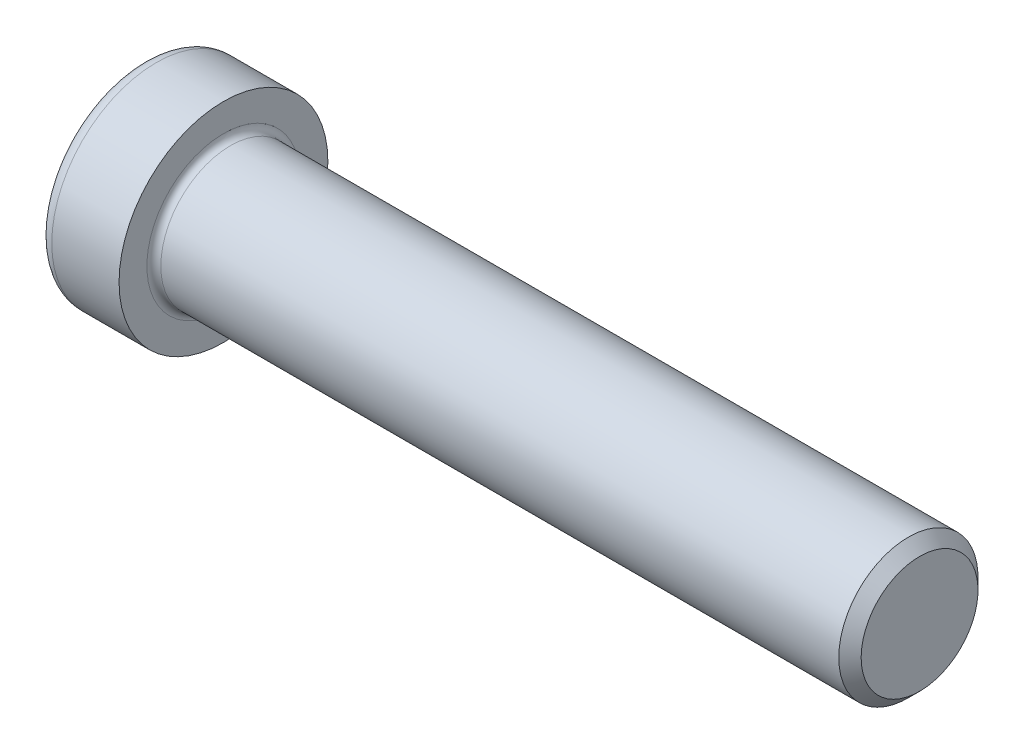
ISO-10303-21;
HEADER;
FILE_DESCRIPTION(('STEP AP214'),'2;1');
FILE_NAME('part.step','',(''),(''),'','','');
FILE_SCHEMA(('AUTOMOTIVE_DESIGN { 1 0 10303 214 1 1 1 1 }'));
ENDSEC;
DATA;
#1=APPLICATION_CONTEXT('core data for automotive mechanical design processes');
#2=APPLICATION_PROTOCOL_DEFINITION('international standard','automotive_design',2000,#1);
#3=PRODUCT_CONTEXT('',#1,'mechanical');
#4=PRODUCT('Part','Part','',(#3));
#5=PRODUCT_RELATED_PRODUCT_CATEGORY('part','',(#4));
#6=PRODUCT_DEFINITION_FORMATION('','',#4);
#7=PRODUCT_DEFINITION_CONTEXT('part definition',#1,'design');
#8=PRODUCT_DEFINITION('design','',#6,#7);
#9=PRODUCT_DEFINITION_SHAPE('','',#8);
#10=(LENGTH_UNIT() NAMED_UNIT(*) SI_UNIT(.MILLI.,.METRE.));
#11=(NAMED_UNIT(*) PLANE_ANGLE_UNIT() SI_UNIT($,.RADIAN.));
#12=(NAMED_UNIT(*) SI_UNIT($,.STERADIAN.) SOLID_ANGLE_UNIT());
#13=UNCERTAINTY_MEASURE_WITH_UNIT(LENGTH_MEASURE(1.E-05),#10,'distance_accuracy_value','');
#14=(GEOMETRIC_REPRESENTATION_CONTEXT(3) GLOBAL_UNCERTAINTY_ASSIGNED_CONTEXT((#13)) GLOBAL_UNIT_ASSIGNED_CONTEXT((#10,
#11,#12)) REPRESENTATION_CONTEXT('',''));
#15=CARTESIAN_POINT('',(0.,0.,0.));
#16=DIRECTION('',(0.,0.,1.));
#17=DIRECTION('',(1.,0.,0.));
#18=AXIS2_PLACEMENT_3D('',#15,#16,#17);
#19=CARTESIAN_POINT('',(0.,0.,0.));
#20=DIRECTION('',(-1.,0.,0.));
#21=DIRECTION('',(0.,0.,1.));
#22=AXIS2_PLACEMENT_3D('',#19,#20,#21);
#23=PLANE('',#22);
#24=DIRECTION('',(0.,-0.499999999999998,0.86602540378444));
#25=VECTOR('',#24,1.);
#26=CARTESIAN_POINT('',(0.,4.61880215351701,0.));
#27=LINE('',#26,#25);
#28=CARTESIAN_POINT('',(0.,4.61880215351701,0.));
#29=VERTEX_POINT('',#28);
#30=CARTESIAN_POINT('',(0.,2.30940107675852,3.99999999999999));
#31=VERTEX_POINT('',#30);
#32=EDGE_CURVE('E296',#29,#31,#27,.T.);
#33=ORIENTED_EDGE('',*,*,#32,.T.);
#34=DIRECTION('',(0.,1.,0.));
#35=VECTOR('',#34,1.);
#36=CARTESIAN_POINT('',(0.,-2.30940107675849,4.));
#37=LINE('',#36,#35);
#38=CARTESIAN_POINT('',(0.,-2.30940107675849,4.));
#39=VERTEX_POINT('',#38);
#40=EDGE_CURVE('E150',#39,#31,#37,.T.);
#41=ORIENTED_EDGE('',*,*,#40,.F.);
#42=DIRECTION('',(0.,-0.500000000000001,-0.866025403784438));
#43=VECTOR('',#42,1.);
#44=CARTESIAN_POINT('',(0.,-2.30940107675849,4.));
#45=LINE('',#44,#43);
#46=CARTESIAN_POINT('',(0.,-4.618802153517,0.));
#47=VERTEX_POINT('',#46);
#48=EDGE_CURVE('E301',#39,#47,#45,.T.);
#49=ORIENTED_EDGE('',*,*,#48,.T.);
#50=DIRECTION('',(0.,0.499999999999998,-0.86602540378444));
#51=VECTOR('',#50,1.);
#52=CARTESIAN_POINT('',(0.,-4.618802153517,0.));
#53=LINE('',#52,#51);
#54=CARTESIAN_POINT('',(0.,-2.3094010767585,-4.));
#55=VERTEX_POINT('',#54);
#56=EDGE_CURVE('E305',#47,#55,#53,.T.);
#57=ORIENTED_EDGE('',*,*,#56,.T.);
#58=DIRECTION('',(0.,-1.,0.));
#59=VECTOR('',#58,1.);
#60=CARTESIAN_POINT('',(0.,2.3094010767585,-4.00000000000001));
#61=LINE('',#60,#59);
#62=CARTESIAN_POINT('',(0.,2.3094010767585,-4.00000000000001));
#63=VERTEX_POINT('',#62);
#64=EDGE_CURVE('E309',#63,#55,#61,.T.);
#65=ORIENTED_EDGE('',*,*,#64,.F.);
#66=DIRECTION('',(0.,-0.500000000000001,-0.866025403784438));
#67=VECTOR('',#66,1.);
#68=CARTESIAN_POINT('',(0.,4.61880215351701,0.));
#69=LINE('',#68,#67);
#70=EDGE_CURVE('E145',#29,#63,#69,.T.);
#71=ORIENTED_EDGE('',*,*,#70,.F.);
#72=EDGE_LOOP('',(#33,#41,#49,#57,#65,#71));
#73=FACE_BOUND('',#72,.T.);
#74=CARTESIAN_POINT('',(0.,0.,0.));
#75=DIRECTION('',(-1.,0.,0.));
#76=DIRECTION('',(0.,0.,1.));
#77=AXIS2_PLACEMENT_3D('',#74,#75,#76);
#78=CIRCLE('',#77,7.8);
#79=CARTESIAN_POINT('',(0.,0.,7.8));
#80=VERTEX_POINT('',#79);
#81=EDGE_CURVE('E60',#80,#80,#78,.T.);
#82=ORIENTED_EDGE('',*,*,#81,.T.);
#83=EDGE_LOOP('',(#82));
#84=FACE_BOUND('',#83,.T.);
#85=ADVANCED_FACE('F51',(#73,#84),#23,.T.);
#86=CARTESIAN_POINT('',(-31.75,0.,0.));
#87=DIRECTION('',(-1.,0.,0.));
#88=DIRECTION('',(0.,0.,1.));
#89=AXIS2_PLACEMENT_3D('',#86,#87,#88);
#90=CYLINDRICAL_SURFACE('',#89,9.);
#91=CARTESIAN_POINT('',(1.2,0.,0.));
#92=DIRECTION('',(-1.,0.,0.));
#93=DIRECTION('',(0.,0.,1.));
#94=AXIS2_PLACEMENT_3D('',#91,#92,#93);
#95=CIRCLE('',#94,9.);
#96=CARTESIAN_POINT('',(1.2,0.,9.));
#97=VERTEX_POINT('',#96);
#98=EDGE_CURVE('E11',#97,#97,#95,.F.);
#99=ORIENTED_EDGE('',*,*,#98,.T.);
#100=EDGE_LOOP('',(#99));
#101=FACE_BOUND('',#100,.T.);
#102=CARTESIAN_POINT('',(7.,0.,0.));
#103=DIRECTION('',(-1.,0.,0.));
#104=DIRECTION('',(0.,0.,1.));
#105=AXIS2_PLACEMENT_3D('',#102,#103,#104);
#106=CIRCLE('',#105,9.);
#107=CARTESIAN_POINT('',(7.,0.,9.));
#108=VERTEX_POINT('',#107);
#109=EDGE_CURVE('E175',#108,#108,#106,.T.);
#110=ORIENTED_EDGE('',*,*,#109,.T.);
#111=EDGE_LOOP('',(#110));
#112=FACE_BOUND('',#111,.T.);
#113=ADVANCED_FACE('F204',(#101,#112),#90,.T.);
#114=CARTESIAN_POINT('',(7.,9.,0.));
#115=DIRECTION('',(1.,0.,0.));
#116=DIRECTION('',(0.,0.,-1.));
#117=AXIS2_PLACEMENT_3D('',#114,#115,#116);
#118=PLANE('',#117);
#119=CARTESIAN_POINT('',(7.,0.,0.));
#120=DIRECTION('',(1.,0.,0.));
#121=DIRECTION('',(0.,0.,-1.));
#122=AXIS2_PLACEMENT_3D('',#119,#120,#121);
#123=CIRCLE('',#122,6.59999999999984);
#124=CARTESIAN_POINT('',(7.,0.,-6.59999999999984));
#125=VERTEX_POINT('',#124);
#126=EDGE_CURVE('E179',#125,#125,#123,.F.);
#127=ORIENTED_EDGE('',*,*,#126,.T.);
#128=EDGE_LOOP('',(#127));
#129=FACE_BOUND('',#128,.T.);
#130=ORIENTED_EDGE('',*,*,#109,.F.);
#131=EDGE_LOOP('',(#130));
#132=FACE_BOUND('',#131,.T.);
#133=ADVANCED_FACE('F210',(#129,#132),#118,.T.);
#134=CARTESIAN_POINT('',(-31.75,0.,0.));
#135=DIRECTION('',(-1.,0.,0.));
#136=DIRECTION('',(0.,0.,1.));
#137=AXIS2_PLACEMENT_3D('',#134,#135,#136);
#138=CYLINDRICAL_SURFACE('',#137,5.99999999999984);
#139=CARTESIAN_POINT('',(7.6,0.,0.));
#140=DIRECTION('',(1.,0.,0.));
#141=DIRECTION('',(0.,0.,-1.));
#142=AXIS2_PLACEMENT_3D('',#139,#140,#141);
#143=CIRCLE('',#142,5.99999999999984);
#144=CARTESIAN_POINT('',(7.6,0.,-5.99999999999984));
#145=VERTEX_POINT('',#144);
#146=EDGE_CURVE('E183',#145,#145,#143,.T.);
#147=ORIENTED_EDGE('',*,*,#146,.T.);
#148=EDGE_LOOP('',(#147));
#149=FACE_BOUND('',#148,.T.);
#150=CARTESIAN_POINT('',(66.0359999999997,0.,0.));
#151=DIRECTION('',(-1.,0.,0.));
#152=DIRECTION('',(0.,0.,1.));
#153=AXIS2_PLACEMENT_3D('',#150,#151,#152);
#154=CIRCLE('',#153,5.99999999999968);
#155=CARTESIAN_POINT('',(66.0359999999997,0.,5.99999999999968));
#156=VERTEX_POINT('',#155);
#157=EDGE_CURVE('E171',#156,#156,#154,.T.);
#158=ORIENTED_EDGE('',*,*,#157,.T.);
#159=EDGE_LOOP('',(#158));
#160=FACE_BOUND('',#159,.T.);
#161=ADVANCED_FACE('F216',(#149,#160),#138,.T.);
#162=CARTESIAN_POINT('',(67.,0.,0.));
#163=DIRECTION('',(-1.,0.,0.));
#164=DIRECTION('',(0.,0.,1.));
#165=AXIS2_PLACEMENT_3D('',#162,#163,#164);
#166=CONICAL_SURFACE('',#165,5.036,0.78539816339712);
#167=ORIENTED_EDGE('',*,*,#157,.F.);
#168=EDGE_LOOP('',(#167));
#169=FACE_BOUND('',#168,.T.);
#170=CARTESIAN_POINT('',(67.,0.,0.));
#171=DIRECTION('',(-1.,0.,0.));
#172=DIRECTION('',(0.,0.,1.));
#173=AXIS2_PLACEMENT_3D('',#170,#171,#172);
#174=CIRCLE('',#173,5.036);
#175=CARTESIAN_POINT('',(67.,0.,5.036));
#176=VERTEX_POINT('',#175);
#177=EDGE_CURVE('E166',#176,#176,#174,.T.);
#178=ORIENTED_EDGE('',*,*,#177,.T.);
#179=EDGE_LOOP('',(#178));
#180=FACE_BOUND('',#179,.T.);
#181=ADVANCED_FACE('F220',(#169,#180),#166,.T.);
#182=CARTESIAN_POINT('',(67.,5.036,0.));
#183=DIRECTION('',(1.,0.,0.));
#184=DIRECTION('',(0.,0.,-1.));
#185=AXIS2_PLACEMENT_3D('',#182,#183,#184);
#186=PLANE('',#185);
#187=ORIENTED_EDGE('',*,*,#177,.F.);
#188=EDGE_LOOP('',(#187));
#189=FACE_BOUND('',#188,.T.);
#190=ADVANCED_FACE('F200',(#189),#186,.T.);
#191=CARTESIAN_POINT('',(7.6,0.,0.));
#192=DIRECTION('',(1.,0.,0.));
#193=DIRECTION('',(0.,0.,-1.));
#194=AXIS2_PLACEMENT_3D('',#191,#192,#193);
#195=TOROIDAL_SURFACE('',#194,6.59999999999984,0.6);
#196=ORIENTED_EDGE('',*,*,#146,.F.);
#197=EDGE_LOOP('',(#196));
#198=FACE_BOUND('',#197,.T.);
#199=ORIENTED_EDGE('',*,*,#126,.F.);
#200=EDGE_LOOP('',(#199));
#201=FACE_BOUND('',#200,.T.);
#202=ADVANCED_FACE('F193',(#198,#201),#195,.F.);
#203=CARTESIAN_POINT('',(1.2,0.,0.));
#204=DIRECTION('',(-1.,0.,0.));
#205=DIRECTION('',(0.,0.,1.));
#206=AXIS2_PLACEMENT_3D('',#203,#204,#205);
#207=TOROIDAL_SURFACE('',#206,7.8,1.2);
#208=ORIENTED_EDGE('',*,*,#98,.F.);
#209=EDGE_LOOP('',(#208));
#210=FACE_BOUND('',#209,.T.);
#211=ORIENTED_EDGE('',*,*,#81,.F.);
#212=EDGE_LOOP('',(#211));
#213=FACE_BOUND('',#212,.T.);
#214=ADVANCED_FACE('F53',(#210,#213),#207,.T.);
#215=CARTESIAN_POINT('',(5.,4.61880215351701,0.));
#216=DIRECTION('',(0.,-0.86602540378444,-0.499999999999998));
#217=DIRECTION('',(0.,0.499999999999998,-0.86602540378444));
#218=AXIS2_PLACEMENT_3D('',#215,#216,#217);
#219=PLANE('',#218);
#220=ORIENTED_EDGE('',*,*,#32,.F.);
#221=DIRECTION('',(-1.,0.,0.));
#222=VECTOR('',#221,1.);
#223=CARTESIAN_POINT('',(5.,4.61880215351701,0.));
#224=LINE('',#223,#222);
#225=CARTESIAN_POINT('',(5.,4.61880215351701,0.));
#226=VERTEX_POINT('',#225);
#227=EDGE_CURVE('E282',#226,#29,#224,.T.);
#228=ORIENTED_EDGE('',*,*,#227,.F.);
#229=DIRECTION('',(0.,-0.499999999999998,0.86602540378444));
#230=VECTOR('',#229,1.);
#231=CARTESIAN_POINT('',(5.,4.61880215351701,0.));
#232=LINE('',#231,#230);
#233=CARTESIAN_POINT('',(5.,3.46410161513776,1.99999999999999));
#234=VERTEX_POINT('',#233);
#235=EDGE_CURVE('E136',#226,#234,#232,.T.);
#236=ORIENTED_EDGE('',*,*,#235,.T.);
#237=CARTESIAN_POINT('',(5.,2.30940107675852,3.99999999999999));
#238=VERTEX_POINT('',#237);
#239=EDGE_CURVE('E126',#234,#238,#232,.T.);
#240=ORIENTED_EDGE('',*,*,#239,.T.);
#241=DIRECTION('',(-1.,0.,0.));
#242=VECTOR('',#241,1.);
#243=CARTESIAN_POINT('',(5.,2.30940107675852,3.99999999999999));
#244=LINE('',#243,#242);
#245=EDGE_CURVE('E141',#238,#31,#244,.T.);
#246=ORIENTED_EDGE('',*,*,#245,.T.);
#247=EDGE_LOOP('',(#220,#228,#236,#240,#246));
#248=FACE_BOUND('',#247,.T.);
#249=ADVANCED_FACE('F140',(#248),#219,.T.);
#250=CARTESIAN_POINT('',(5.,-2.30940107675849,4.));
#251=DIRECTION('',(0.,0.,1.));
#252=DIRECTION('',(0.,-1.,0.));
#253=AXIS2_PLACEMENT_3D('',#250,#251,#252);
#254=PLANE('',#253);
#255=ORIENTED_EDGE('',*,*,#40,.T.);
#256=ORIENTED_EDGE('',*,*,#245,.F.);
#257=DIRECTION('',(0.,1.,0.));
#258=VECTOR('',#257,1.);
#259=CARTESIAN_POINT('',(5.,-2.30940107675849,4.));
#260=LINE('',#259,#258);
#261=CARTESIAN_POINT('',(5.,0.,3.99999999999999));
#262=VERTEX_POINT('',#261);
#263=EDGE_CURVE('E123',#262,#238,#260,.T.);
#264=ORIENTED_EDGE('',*,*,#263,.F.);
#265=CARTESIAN_POINT('',(5.,-2.30940107675849,4.));
#266=VERTEX_POINT('',#265);
#267=EDGE_CURVE('E135',#266,#262,#260,.T.);
#268=ORIENTED_EDGE('',*,*,#267,.F.);
#269=DIRECTION('',(-1.,0.,0.));
#270=VECTOR('',#269,1.);
#271=CARTESIAN_POINT('',(5.,-2.30940107675849,4.));
#272=LINE('',#271,#270);
#273=EDGE_CURVE('E153',#266,#39,#272,.T.);
#274=ORIENTED_EDGE('',*,*,#273,.T.);
#275=EDGE_LOOP('',(#255,#256,#264,#268,#274));
#276=FACE_BOUND('',#275,.T.);
#277=ADVANCED_FACE('F147',(#276),#254,.F.);
#278=CARTESIAN_POINT('',(5.,-2.30940107675849,4.));
#279=DIRECTION('',(0.,0.866025403784438,-0.500000000000001));
#280=DIRECTION('',(0.,0.500000000000001,0.866025403784438));
#281=AXIS2_PLACEMENT_3D('',#278,#279,#280);
#282=PLANE('',#281);
#283=ORIENTED_EDGE('',*,*,#48,.F.);
#284=ORIENTED_EDGE('',*,*,#273,.F.);
#285=DIRECTION('',(0.,-0.500000000000001,-0.866025403784438));
#286=VECTOR('',#285,1.);
#287=CARTESIAN_POINT('',(5.,-2.30940107675849,4.));
#288=LINE('',#287,#286);
#289=CARTESIAN_POINT('',(5.,-3.46410161513774,2.));
#290=VERTEX_POINT('',#289);
#291=EDGE_CURVE('E344',#266,#290,#288,.T.);
#292=ORIENTED_EDGE('',*,*,#291,.T.);
#293=CARTESIAN_POINT('',(5.,-4.618802153517,0.));
#294=VERTEX_POINT('',#293);
#295=EDGE_CURVE('E324',#290,#294,#288,.T.);
#296=ORIENTED_EDGE('',*,*,#295,.T.);
#297=DIRECTION('',(-1.,0.,0.));
#298=VECTOR('',#297,1.);
#299=CARTESIAN_POINT('',(5.,-4.618802153517,0.));
#300=LINE('',#299,#298);
#301=EDGE_CURVE('E161',#294,#47,#300,.T.);
#302=ORIENTED_EDGE('',*,*,#301,.T.);
#303=EDGE_LOOP('',(#283,#284,#292,#296,#302));
#304=FACE_BOUND('',#303,.T.);
#305=ADVANCED_FACE('F234',(#304),#282,.T.);
#306=CARTESIAN_POINT('',(5.,-4.618802153517,0.));
#307=DIRECTION('',(0.,0.86602540378444,0.499999999999998));
#308=DIRECTION('',(0.,-0.499999999999998,0.86602540378444));
#309=AXIS2_PLACEMENT_3D('',#306,#307,#308);
#310=PLANE('',#309);
#311=ORIENTED_EDGE('',*,*,#56,.F.);
#312=ORIENTED_EDGE('',*,*,#301,.F.);
#313=DIRECTION('',(0.,0.499999999999998,-0.86602540378444));
#314=VECTOR('',#313,1.);
#315=CARTESIAN_POINT('',(5.,-4.618802153517,0.));
#316=LINE('',#315,#314);
#317=CARTESIAN_POINT('',(5.,-3.46410161513776,-1.99999999999999));
#318=VERTEX_POINT('',#317);
#319=EDGE_CURVE('E291',#294,#318,#316,.T.);
#320=ORIENTED_EDGE('',*,*,#319,.T.);
#321=CARTESIAN_POINT('',(5.,-2.3094010767585,-4.));
#322=VERTEX_POINT('',#321);
#323=EDGE_CURVE('E342',#318,#322,#316,.T.);
#324=ORIENTED_EDGE('',*,*,#323,.T.);
#325=DIRECTION('',(-1.,0.,0.));
#326=VECTOR('',#325,1.);
#327=CARTESIAN_POINT('',(5.,-2.3094010767585,-4.));
#328=LINE('',#327,#326);
#329=EDGE_CURVE('E281',#322,#55,#328,.T.);
#330=ORIENTED_EDGE('',*,*,#329,.T.);
#331=EDGE_LOOP('',(#311,#312,#320,#324,#330));
#332=FACE_BOUND('',#331,.T.);
#333=ADVANCED_FACE('F237',(#332),#310,.T.);
#334=CARTESIAN_POINT('',(5.,2.3094010767585,-4.00000000000001));
#335=DIRECTION('',(0.,0.,-1.));
#336=DIRECTION('',(0.,1.,0.));
#337=AXIS2_PLACEMENT_3D('',#334,#335,#336);
#338=PLANE('',#337);
#339=ORIENTED_EDGE('',*,*,#64,.T.);
#340=ORIENTED_EDGE('',*,*,#329,.F.);
#341=DIRECTION('',(0.,-1.,0.));
#342=VECTOR('',#341,1.);
#343=CARTESIAN_POINT('',(5.,2.3094010767585,-4.00000000000001));
#344=LINE('',#343,#342);
#345=CARTESIAN_POINT('',(5.,0.,-4.));
#346=VERTEX_POINT('',#345);
#347=EDGE_CURVE('E285',#346,#322,#344,.T.);
#348=ORIENTED_EDGE('',*,*,#347,.F.);
#349=CARTESIAN_POINT('',(5.,2.3094010767585,-4.00000000000001));
#350=VERTEX_POINT('',#349);
#351=EDGE_CURVE('E67',#350,#346,#344,.T.);
#352=ORIENTED_EDGE('',*,*,#351,.F.);
#353=DIRECTION('',(-1.,0.,0.));
#354=VECTOR('',#353,1.);
#355=CARTESIAN_POINT('',(5.,2.3094010767585,-4.00000000000001));
#356=LINE('',#355,#354);
#357=EDGE_CURVE('E277',#350,#63,#356,.T.);
#358=ORIENTED_EDGE('',*,*,#357,.T.);
#359=EDGE_LOOP('',(#339,#340,#348,#352,#358));
#360=FACE_BOUND('',#359,.T.);
#361=ADVANCED_FACE('F241',(#360),#338,.F.);
#362=CARTESIAN_POINT('',(5.,4.61880215351701,0.));
#363=DIRECTION('',(0.,0.866025403784438,-0.500000000000001));
#364=DIRECTION('',(0.,0.500000000000001,0.866025403784438));
#365=AXIS2_PLACEMENT_3D('',#362,#363,#364);
#366=PLANE('',#365);
#367=ORIENTED_EDGE('',*,*,#70,.T.);
#368=ORIENTED_EDGE('',*,*,#357,.F.);
#369=DIRECTION('',(0.,-0.500000000000001,-0.866025403784438));
#370=VECTOR('',#369,1.);
#371=CARTESIAN_POINT('',(5.,4.61880215351701,0.));
#372=LINE('',#371,#370);
#373=CARTESIAN_POINT('',(5.,3.46410161513776,-2.00000000000001));
#374=VERTEX_POINT('',#373);
#375=EDGE_CURVE('E266',#374,#350,#372,.T.);
#376=ORIENTED_EDGE('',*,*,#375,.F.);
#377=EDGE_CURVE('E273',#226,#374,#372,.T.);
#378=ORIENTED_EDGE('',*,*,#377,.F.);
#379=ORIENTED_EDGE('',*,*,#227,.T.);
#380=EDGE_LOOP('',(#367,#368,#376,#378,#379));
#381=FACE_BOUND('',#380,.T.);
#382=ADVANCED_FACE('F245',(#381),#366,.F.);
#383=CARTESIAN_POINT('',(5.,6.9282032302755,-4.00000000000001));
#384=DIRECTION('',(1.,0.,0.));
#385=DIRECTION('',(0.,0.,-1.));
#386=AXIS2_PLACEMENT_3D('',#383,#384,#385);
#387=PLANE('',#386);
#388=ORIENTED_EDGE('',*,*,#347,.T.);
#389=ORIENTED_EDGE('',*,*,#323,.F.);
#390=CARTESIAN_POINT('',(5.,0.,0.));
#391=DIRECTION('',(-1.,0.,0.));
#392=DIRECTION('',(0.,0.,1.));
#393=AXIS2_PLACEMENT_3D('',#390,#391,#392);
#394=CIRCLE('',#393,4.);
#395=EDGE_CURVE('E333',#346,#318,#394,.T.);
#396=ORIENTED_EDGE('',*,*,#395,.F.);
#397=EDGE_LOOP('',(#388,#389,#396));
#398=FACE_BOUND('',#397,.T.);
#399=ADVANCED_FACE('F249',(#398),#387,.F.);
#400=ORIENTED_EDGE('',*,*,#319,.F.);
#401=ORIENTED_EDGE('',*,*,#295,.F.);
#402=EDGE_CURVE('E159',#318,#290,#394,.T.);
#403=ORIENTED_EDGE('',*,*,#402,.F.);
#404=EDGE_LOOP('',(#400,#401,#403));
#405=FACE_BOUND('',#404,.T.);
#406=ADVANCED_FACE('F252',(#405),#387,.F.);
#407=ORIENTED_EDGE('',*,*,#291,.F.);
#408=ORIENTED_EDGE('',*,*,#267,.T.);
#409=EDGE_CURVE('E152',#290,#262,#394,.T.);
#410=ORIENTED_EDGE('',*,*,#409,.F.);
#411=EDGE_LOOP('',(#407,#408,#410));
#412=FACE_BOUND('',#411,.T.);
#413=ADVANCED_FACE('F257',(#412),#387,.F.);
#414=ORIENTED_EDGE('',*,*,#263,.T.);
#415=ORIENTED_EDGE('',*,*,#239,.F.);
#416=EDGE_CURVE('E129',#262,#234,#394,.T.);
#417=ORIENTED_EDGE('',*,*,#416,.F.);
#418=EDGE_LOOP('',(#414,#415,#417));
#419=FACE_BOUND('',#418,.T.);
#420=ADVANCED_FACE('F125',(#419),#387,.F.);
#421=ORIENTED_EDGE('',*,*,#235,.F.);
#422=ORIENTED_EDGE('',*,*,#377,.T.);
#423=EDGE_CURVE('E167',#234,#374,#394,.T.);
#424=ORIENTED_EDGE('',*,*,#423,.F.);
#425=EDGE_LOOP('',(#421,#422,#424));
#426=FACE_BOUND('',#425,.T.);
#427=ADVANCED_FACE('F260',(#426),#387,.F.);
#428=ORIENTED_EDGE('',*,*,#375,.T.);
#429=ORIENTED_EDGE('',*,*,#351,.T.);
#430=EDGE_CURVE('E269',#374,#346,#394,.T.);
#431=ORIENTED_EDGE('',*,*,#430,.F.);
#432=EDGE_LOOP('',(#428,#429,#431));
#433=FACE_BOUND('',#432,.T.);
#434=ADVANCED_FACE('F230',(#433),#387,.F.);
#435=CARTESIAN_POINT('',(5.,0.,0.));
#436=DIRECTION('',(-1.,0.,0.));
#437=DIRECTION('',(0.,0.,1.));
#438=AXIS2_PLACEMENT_3D('',#435,#436,#437);
#439=CONICAL_SURFACE('',#438,4.,1.04719755119659);
#440=CARTESIAN_POINT('',(7.30940107675852,0.,0.));
#441=VERTEX_POINT('',#440);
#442=VERTEX_LOOP('',#441);
#443=FACE_BOUND('',#442,.T.);
#444=ORIENTED_EDGE('',*,*,#416,.T.);
#445=ORIENTED_EDGE('',*,*,#423,.T.);
#446=ORIENTED_EDGE('',*,*,#430,.T.);
#447=ORIENTED_EDGE('',*,*,#395,.T.);
#448=ORIENTED_EDGE('',*,*,#402,.T.);
#449=ORIENTED_EDGE('',*,*,#409,.T.);
#450=EDGE_LOOP('',(#444,#445,#446,#447,#448,#449));
#451=FACE_BOUND('',#450,.T.);
#452=ADVANCED_FACE('F228',(#443,#451),#439,.F.);
#453=CLOSED_SHELL('',(#85,#113,#133,#161,#181,#190,#202,#214,#249,#277,#305,#333,#361,#382,#399,
#406,#413,#420,#427,#434,#452));
#454=MANIFOLD_SOLID_BREP('B2',#453);
#455=ADVANCED_BREP_SHAPE_REPRESENTATION('',(#18,#454),#14);
#456=SHAPE_DEFINITION_REPRESENTATION(#9,#455);
ENDSEC;
END-ISO-10303-21;
